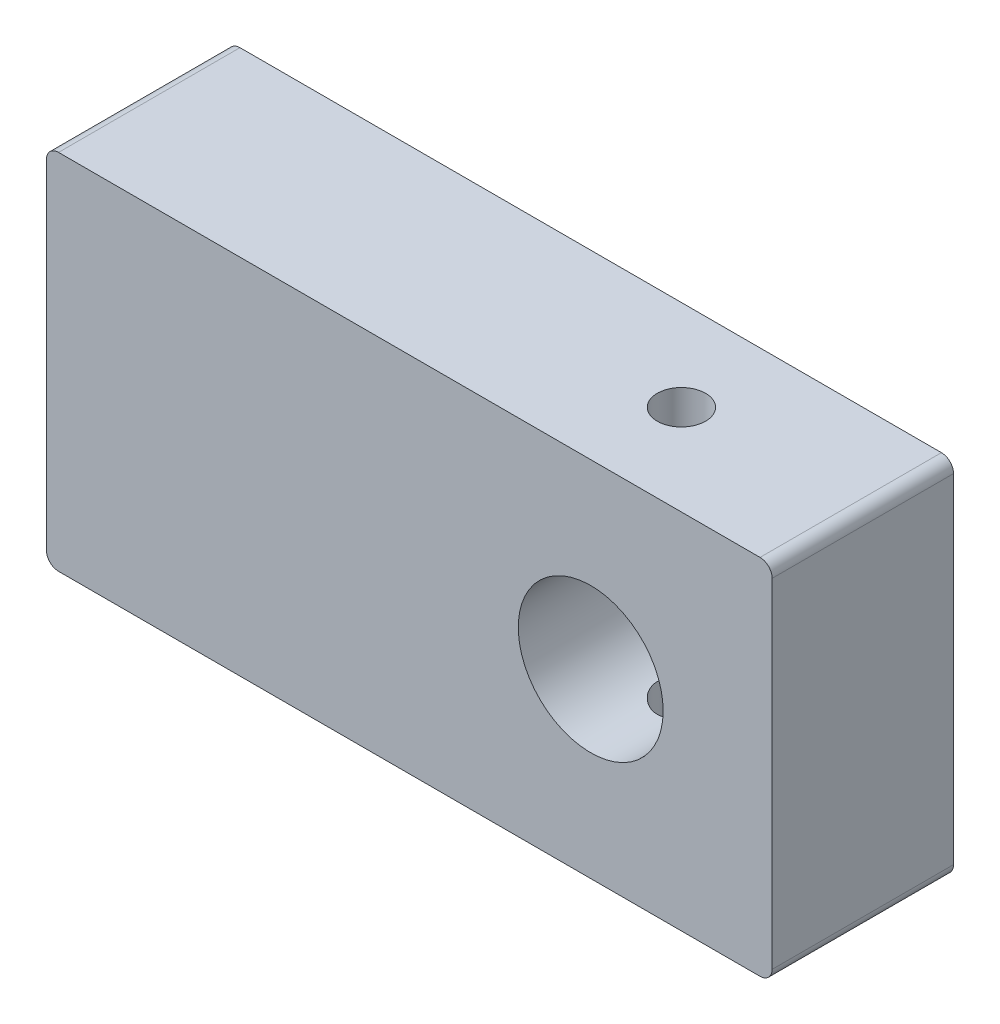
ISO-10303-21;
HEADER;
FILE_DESCRIPTION(('STEP AP214'),'2;1');
FILE_NAME('part.step','',(''),(''),'','','');
FILE_SCHEMA(('AUTOMOTIVE_DESIGN { 1 0 10303 214 1 1 1 1 }'));
ENDSEC;
DATA;
#1=APPLICATION_CONTEXT('core data for automotive mechanical design processes');
#2=APPLICATION_PROTOCOL_DEFINITION('international standard','automotive_design',2000,#1);
#3=PRODUCT_CONTEXT('',#1,'mechanical');
#4=PRODUCT('Part','Part','',(#3));
#5=PRODUCT_RELATED_PRODUCT_CATEGORY('part','',(#4));
#6=PRODUCT_DEFINITION_FORMATION('','',#4);
#7=PRODUCT_DEFINITION_CONTEXT('part definition',#1,'design');
#8=PRODUCT_DEFINITION('design','',#6,#7);
#9=PRODUCT_DEFINITION_SHAPE('','',#8);
#10=(LENGTH_UNIT() NAMED_UNIT(*) SI_UNIT(.MILLI.,.METRE.));
#11=(NAMED_UNIT(*) PLANE_ANGLE_UNIT() SI_UNIT($,.RADIAN.));
#12=(NAMED_UNIT(*) SI_UNIT($,.STERADIAN.) SOLID_ANGLE_UNIT());
#13=UNCERTAINTY_MEASURE_WITH_UNIT(LENGTH_MEASURE(1.E-05),#10,'distance_accuracy_value','');
#14=(GEOMETRIC_REPRESENTATION_CONTEXT(3) GLOBAL_UNCERTAINTY_ASSIGNED_CONTEXT((#13)) GLOBAL_UNIT_ASSIGNED_CONTEXT((#10,
#11,#12)) REPRESENTATION_CONTEXT('',''));
#15=CARTESIAN_POINT('',(0.,0.,0.));
#16=DIRECTION('',(0.,0.,1.));
#17=DIRECTION('',(1.,0.,0.));
#18=AXIS2_PLACEMENT_3D('',#15,#16,#17);
#19=CARTESIAN_POINT('',(29.,14.,7.5));
#20=DIRECTION('',(0.,0.,-1.));
#21=DIRECTION('',(-1.,0.,0.));
#22=AXIS2_PLACEMENT_3D('',#19,#20,#21);
#23=PLANE('',#22);
#24=CARTESIAN_POINT('',(29.,14.,7.5));
#25=DIRECTION('',(0.,0.,1.));
#26=DIRECTION('',(-1.,0.,0.));
#27=AXIS2_PLACEMENT_3D('',#24,#25,#26);
#28=CIRCLE('',#27,1.);
#29=CARTESIAN_POINT('',(30.,14.,7.5));
#30=VERTEX_POINT('',#29);
#31=CARTESIAN_POINT('',(29.,15.,7.5));
#32=VERTEX_POINT('',#31);
#33=EDGE_CURVE('E155',#30,#32,#28,.T.);
#34=ORIENTED_EDGE('',*,*,#33,.T.);
#35=DIRECTION('',(-1.,0.,0.));
#36=VECTOR('',#35,1.);
#37=CARTESIAN_POINT('',(-29.,15.,7.5));
#38=LINE('',#37,#36);
#39=CARTESIAN_POINT('',(-29.,15.,7.5));
#40=VERTEX_POINT('',#39);
#41=EDGE_CURVE('E103',#32,#40,#38,.T.);
#42=ORIENTED_EDGE('',*,*,#41,.T.);
#43=CARTESIAN_POINT('',(-29.,14.,7.5));
#44=DIRECTION('',(0.,0.,1.));
#45=DIRECTION('',(1.,0.,0.));
#46=AXIS2_PLACEMENT_3D('',#43,#44,#45);
#47=CIRCLE('',#46,1.);
#48=CARTESIAN_POINT('',(-30.,14.,7.5));
#49=VERTEX_POINT('',#48);
#50=EDGE_CURVE('E244',#40,#49,#47,.T.);
#51=ORIENTED_EDGE('',*,*,#50,.T.);
#52=DIRECTION('',(0.,-1.,0.));
#53=VECTOR('',#52,1.);
#54=CARTESIAN_POINT('',(-30.,14.,7.5));
#55=LINE('',#54,#53);
#56=CARTESIAN_POINT('',(-30.,-14.,7.5));
#57=VERTEX_POINT('',#56);
#58=EDGE_CURVE('E251',#49,#57,#55,.T.);
#59=ORIENTED_EDGE('',*,*,#58,.T.);
#60=CARTESIAN_POINT('',(-29.,-14.,7.5));
#61=DIRECTION('',(0.,0.,1.));
#62=DIRECTION('',(1.,0.,0.));
#63=AXIS2_PLACEMENT_3D('',#60,#61,#62);
#64=CIRCLE('',#63,1.);
#65=CARTESIAN_POINT('',(-29.,-15.,7.5));
#66=VERTEX_POINT('',#65);
#67=EDGE_CURVE('E122',#57,#66,#64,.T.);
#68=ORIENTED_EDGE('',*,*,#67,.T.);
#69=DIRECTION('',(1.,0.,0.));
#70=VECTOR('',#69,1.);
#71=CARTESIAN_POINT('',(-29.,-15.,7.5));
#72=LINE('',#71,#70);
#73=CARTESIAN_POINT('',(29.,-15.,7.5));
#74=VERTEX_POINT('',#73);
#75=EDGE_CURVE('E116',#66,#74,#72,.T.);
#76=ORIENTED_EDGE('',*,*,#75,.T.);
#77=CARTESIAN_POINT('',(29.,-14.,7.5));
#78=DIRECTION('',(0.,0.,1.));
#79=DIRECTION('',(1.,0.,0.));
#80=AXIS2_PLACEMENT_3D('',#77,#78,#79);
#81=CIRCLE('',#80,1.);
#82=CARTESIAN_POINT('',(30.,-14.,7.5));
#83=VERTEX_POINT('',#82);
#84=EDGE_CURVE('E120',#74,#83,#81,.T.);
#85=ORIENTED_EDGE('',*,*,#84,.T.);
#86=DIRECTION('',(0.,1.,0.));
#87=VECTOR('',#86,1.);
#88=CARTESIAN_POINT('',(30.,14.,7.5));
#89=LINE('',#88,#87);
#90=EDGE_CURVE('E60',#83,#30,#89,.T.);
#91=ORIENTED_EDGE('',*,*,#90,.T.);
#92=EDGE_LOOP('',(#34,#42,#51,#59,#68,#76,#85,#91));
#93=FACE_BOUND('',#92,.T.);
#94=CARTESIAN_POINT('',(15.,0.,7.5));
#95=DIRECTION('',(0.,0.,1.));
#96=DIRECTION('',(1.,0.,0.));
#97=AXIS2_PLACEMENT_3D('',#94,#95,#96);
#98=CIRCLE('',#97,5.99);
#99=CARTESIAN_POINT('',(20.99,0.,7.5));
#100=VERTEX_POINT('',#99);
#101=EDGE_CURVE('E144',#100,#100,#98,.T.);
#102=ORIENTED_EDGE('',*,*,#101,.F.);
#103=EDGE_LOOP('',(#102));
#104=FACE_BOUND('',#103,.T.);
#105=ADVANCED_FACE('F36',(#93,#104),#23,.F.);
#106=CARTESIAN_POINT('',(29.,14.,-7.5));
#107=DIRECTION('',(0.,0.,-1.));
#108=DIRECTION('',(-1.,0.,0.));
#109=AXIS2_PLACEMENT_3D('',#106,#107,#108);
#110=PLANE('',#109);
#111=CARTESIAN_POINT('',(29.,14.,-7.5));
#112=DIRECTION('',(0.,0.,1.));
#113=DIRECTION('',(-1.,0.,0.));
#114=AXIS2_PLACEMENT_3D('',#111,#112,#113);
#115=CIRCLE('',#114,1.);
#116=CARTESIAN_POINT('',(30.,14.,-7.5));
#117=VERTEX_POINT('',#116);
#118=CARTESIAN_POINT('',(29.,15.,-7.5));
#119=VERTEX_POINT('',#118);
#120=EDGE_CURVE('E140',#117,#119,#115,.T.);
#121=ORIENTED_EDGE('',*,*,#120,.F.);
#122=DIRECTION('',(0.,1.,0.));
#123=VECTOR('',#122,1.);
#124=CARTESIAN_POINT('',(30.,14.,-7.5));
#125=LINE('',#124,#123);
#126=CARTESIAN_POINT('',(30.,-14.,-7.5));
#127=VERTEX_POINT('',#126);
#128=EDGE_CURVE('E95',#127,#117,#125,.T.);
#129=ORIENTED_EDGE('',*,*,#128,.F.);
#130=CARTESIAN_POINT('',(29.,-14.,-7.5));
#131=DIRECTION('',(0.,0.,1.));
#132=DIRECTION('',(1.,0.,0.));
#133=AXIS2_PLACEMENT_3D('',#130,#131,#132);
#134=CIRCLE('',#133,1.);
#135=CARTESIAN_POINT('',(29.,-15.,-7.5));
#136=VERTEX_POINT('',#135);
#137=EDGE_CURVE('E89',#136,#127,#134,.T.);
#138=ORIENTED_EDGE('',*,*,#137,.F.);
#139=DIRECTION('',(1.,0.,0.));
#140=VECTOR('',#139,1.);
#141=CARTESIAN_POINT('',(-29.,-15.,-7.5));
#142=LINE('',#141,#140);
#143=CARTESIAN_POINT('',(-29.,-15.,-7.5));
#144=VERTEX_POINT('',#143);
#145=EDGE_CURVE('E130',#144,#136,#142,.T.);
#146=ORIENTED_EDGE('',*,*,#145,.F.);
#147=CARTESIAN_POINT('',(-29.,-14.,-7.5));
#148=DIRECTION('',(0.,0.,1.));
#149=DIRECTION('',(1.,0.,0.));
#150=AXIS2_PLACEMENT_3D('',#147,#148,#149);
#151=CIRCLE('',#150,1.);
#152=CARTESIAN_POINT('',(-30.,-14.,-7.5));
#153=VERTEX_POINT('',#152);
#154=EDGE_CURVE('E150',#153,#144,#151,.T.);
#155=ORIENTED_EDGE('',*,*,#154,.F.);
#156=DIRECTION('',(0.,-1.,0.));
#157=VECTOR('',#156,1.);
#158=CARTESIAN_POINT('',(-30.,14.,-7.5));
#159=LINE('',#158,#157);
#160=CARTESIAN_POINT('',(-30.,14.,-7.5));
#161=VERTEX_POINT('',#160);
#162=EDGE_CURVE('E148',#161,#153,#159,.T.);
#163=ORIENTED_EDGE('',*,*,#162,.F.);
#164=CARTESIAN_POINT('',(-29.,14.,-7.5));
#165=DIRECTION('',(0.,0.,1.));
#166=DIRECTION('',(1.,0.,0.));
#167=AXIS2_PLACEMENT_3D('',#164,#165,#166);
#168=CIRCLE('',#167,1.);
#169=CARTESIAN_POINT('',(-29.,15.,-7.5));
#170=VERTEX_POINT('',#169);
#171=EDGE_CURVE('E146',#170,#161,#168,.T.);
#172=ORIENTED_EDGE('',*,*,#171,.F.);
#173=DIRECTION('',(-1.,0.,0.));
#174=VECTOR('',#173,1.);
#175=CARTESIAN_POINT('',(-29.,15.,-7.5));
#176=LINE('',#175,#174);
#177=EDGE_CURVE('E143',#119,#170,#176,.T.);
#178=ORIENTED_EDGE('',*,*,#177,.F.);
#179=EDGE_LOOP('',(#121,#129,#138,#146,#155,#163,#172,#178));
#180=FACE_BOUND('',#179,.T.);
#181=CARTESIAN_POINT('',(15.,0.,-7.5));
#182=DIRECTION('',(0.,0.,1.));
#183=DIRECTION('',(1.,0.,0.));
#184=AXIS2_PLACEMENT_3D('',#181,#182,#183);
#185=CIRCLE('',#184,5.99);
#186=CARTESIAN_POINT('',(20.99,0.,-7.5));
#187=VERTEX_POINT('',#186);
#188=EDGE_CURVE('E257',#187,#187,#185,.T.);
#189=ORIENTED_EDGE('',*,*,#188,.T.);
#190=EDGE_LOOP('',(#189));
#191=FACE_BOUND('',#190,.T.);
#192=ADVANCED_FACE('F205',(#180,#191),#110,.T.);
#193=CARTESIAN_POINT('',(29.,14.,7.5));
#194=DIRECTION('',(0.,0.,-1.));
#195=DIRECTION('',(-1.,0.,0.));
#196=AXIS2_PLACEMENT_3D('',#193,#194,#195);
#197=CYLINDRICAL_SURFACE('',#196,1.);
#198=ORIENTED_EDGE('',*,*,#120,.T.);
#199=DIRECTION('',(0.,0.,-1.));
#200=VECTOR('',#199,1.);
#201=CARTESIAN_POINT('',(29.,15.,7.5));
#202=LINE('',#201,#200);
#203=EDGE_CURVE('E11',#32,#119,#202,.T.);
#204=ORIENTED_EDGE('',*,*,#203,.F.);
#205=ORIENTED_EDGE('',*,*,#33,.F.);
#206=DIRECTION('',(0.,0.,-1.));
#207=VECTOR('',#206,1.);
#208=CARTESIAN_POINT('',(30.,14.,7.5));
#209=LINE('',#208,#207);
#210=EDGE_CURVE('E136',#30,#117,#209,.T.);
#211=ORIENTED_EDGE('',*,*,#210,.T.);
#212=EDGE_LOOP('',(#198,#204,#205,#211));
#213=FACE_BOUND('',#212,.T.);
#214=ADVANCED_FACE('F38',(#213),#197,.T.);
#215=CARTESIAN_POINT('',(-29.,15.,7.5));
#216=DIRECTION('',(0.,-1.,0.));
#217=DIRECTION('',(0.,0.,-1.));
#218=AXIS2_PLACEMENT_3D('',#215,#216,#217);
#219=PLANE('',#218);
#220=CARTESIAN_POINT('',(15.,15.,0.));
#221=DIRECTION('',(0.,1.,0.));
#222=DIRECTION('',(0.,0.,1.));
#223=AXIS2_PLACEMENT_3D('',#220,#221,#222);
#224=CIRCLE('',#223,2.);
#225=CARTESIAN_POINT('',(15.,15.,2.));
#226=VERTEX_POINT('',#225);
#227=EDGE_CURVE('E171',#226,#226,#224,.T.);
#228=ORIENTED_EDGE('',*,*,#227,.F.);
#229=EDGE_LOOP('',(#228));
#230=FACE_BOUND('',#229,.T.);
#231=ORIENTED_EDGE('',*,*,#177,.T.);
#232=DIRECTION('',(0.,0.,-1.));
#233=VECTOR('',#232,1.);
#234=CARTESIAN_POINT('',(-29.,15.,7.5));
#235=LINE('',#234,#233);
#236=EDGE_CURVE('E51',#40,#170,#235,.T.);
#237=ORIENTED_EDGE('',*,*,#236,.F.);
#238=ORIENTED_EDGE('',*,*,#41,.F.);
#239=ORIENTED_EDGE('',*,*,#203,.T.);
#240=EDGE_LOOP('',(#231,#237,#238,#239));
#241=FACE_BOUND('',#240,.T.);
#242=ADVANCED_FACE('F229',(#230,#241),#219,.F.);
#243=CARTESIAN_POINT('',(-29.,14.,7.5));
#244=DIRECTION('',(0.,0.,-1.));
#245=DIRECTION('',(-1.,0.,0.));
#246=AXIS2_PLACEMENT_3D('',#243,#244,#245);
#247=CYLINDRICAL_SURFACE('',#246,1.);
#248=ORIENTED_EDGE('',*,*,#171,.T.);
#249=DIRECTION('',(0.,0.,-1.));
#250=VECTOR('',#249,1.);
#251=CARTESIAN_POINT('',(-30.,14.,7.5));
#252=LINE('',#251,#250);
#253=EDGE_CURVE('E162',#49,#161,#252,.T.);
#254=ORIENTED_EDGE('',*,*,#253,.F.);
#255=ORIENTED_EDGE('',*,*,#50,.F.);
#256=ORIENTED_EDGE('',*,*,#236,.T.);
#257=EDGE_LOOP('',(#248,#254,#255,#256));
#258=FACE_BOUND('',#257,.T.);
#259=ADVANCED_FACE('F226',(#258),#247,.T.);
#260=CARTESIAN_POINT('',(-30.,14.,7.5));
#261=DIRECTION('',(1.,0.,0.));
#262=DIRECTION('',(0.,1.,0.));
#263=AXIS2_PLACEMENT_3D('',#260,#261,#262);
#264=PLANE('',#263);
#265=CARTESIAN_POINT('',(-30.,7.99999999999999,0.));
#266=DIRECTION('',(-1.,0.,0.));
#267=DIRECTION('',(0.,-1.,0.));
#268=AXIS2_PLACEMENT_3D('',#265,#266,#267);
#269=CIRCLE('',#268,2.);
#270=CARTESIAN_POINT('',(-30.,5.99999999999999,0.));
#271=VERTEX_POINT('',#270);
#272=EDGE_CURVE('E270',#271,#271,#269,.T.);
#273=ORIENTED_EDGE('',*,*,#272,.F.);
#274=EDGE_LOOP('',(#273));
#275=FACE_BOUND('',#274,.T.);
#276=CARTESIAN_POINT('',(-30.,-8.00000000000001,0.));
#277=DIRECTION('',(-1.,0.,0.));
#278=DIRECTION('',(0.,-1.,0.));
#279=AXIS2_PLACEMENT_3D('',#276,#277,#278);
#280=CIRCLE('',#279,2.);
#281=CARTESIAN_POINT('',(-30.,-10.,0.));
#282=VERTEX_POINT('',#281);
#283=EDGE_CURVE('E263',#282,#282,#280,.T.);
#284=ORIENTED_EDGE('',*,*,#283,.F.);
#285=EDGE_LOOP('',(#284));
#286=FACE_BOUND('',#285,.T.);
#287=ORIENTED_EDGE('',*,*,#162,.T.);
#288=DIRECTION('',(0.,0.,-1.));
#289=VECTOR('',#288,1.);
#290=CARTESIAN_POINT('',(-30.,-14.,7.5));
#291=LINE('',#290,#289);
#292=EDGE_CURVE('E159',#57,#153,#291,.T.);
#293=ORIENTED_EDGE('',*,*,#292,.F.);
#294=ORIENTED_EDGE('',*,*,#58,.F.);
#295=ORIENTED_EDGE('',*,*,#253,.T.);
#296=EDGE_LOOP('',(#287,#293,#294,#295));
#297=FACE_BOUND('',#296,.T.);
#298=ADVANCED_FACE('F222',(#275,#286,#297),#264,.F.);
#299=CARTESIAN_POINT('',(-29.,-14.,7.5));
#300=DIRECTION('',(0.,0.,-1.));
#301=DIRECTION('',(-1.,0.,0.));
#302=AXIS2_PLACEMENT_3D('',#299,#300,#301);
#303=CYLINDRICAL_SURFACE('',#302,1.);
#304=ORIENTED_EDGE('',*,*,#154,.T.);
#305=DIRECTION('',(0.,0.,-1.));
#306=VECTOR('',#305,1.);
#307=CARTESIAN_POINT('',(-29.,-15.,7.5));
#308=LINE('',#307,#306);
#309=EDGE_CURVE('E131',#66,#144,#308,.T.);
#310=ORIENTED_EDGE('',*,*,#309,.F.);
#311=ORIENTED_EDGE('',*,*,#67,.F.);
#312=ORIENTED_EDGE('',*,*,#292,.T.);
#313=EDGE_LOOP('',(#304,#310,#311,#312));
#314=FACE_BOUND('',#313,.T.);
#315=ADVANCED_FACE('F218',(#314),#303,.T.);
#316=CARTESIAN_POINT('',(-29.,-15.,7.5));
#317=DIRECTION('',(0.,1.,0.));
#318=DIRECTION('',(0.,0.,1.));
#319=AXIS2_PLACEMENT_3D('',#316,#317,#318);
#320=PLANE('',#319);
#321=CARTESIAN_POINT('',(15.,-15.,0.));
#322=DIRECTION('',(0.,1.,0.));
#323=DIRECTION('',(0.,0.,1.));
#324=AXIS2_PLACEMENT_3D('',#321,#322,#323);
#325=CIRCLE('',#324,2.);
#326=CARTESIAN_POINT('',(15.,-15.,2.));
#327=VERTEX_POINT('',#326);
#328=EDGE_CURVE('E267',#327,#327,#325,.T.);
#329=ORIENTED_EDGE('',*,*,#328,.T.);
#330=EDGE_LOOP('',(#329));
#331=FACE_BOUND('',#330,.T.);
#332=ORIENTED_EDGE('',*,*,#145,.T.);
#333=DIRECTION('',(0.,0.,-1.));
#334=VECTOR('',#333,1.);
#335=CARTESIAN_POINT('',(29.,-15.,7.5));
#336=LINE('',#335,#334);
#337=EDGE_CURVE('E127',#74,#136,#336,.T.);
#338=ORIENTED_EDGE('',*,*,#337,.F.);
#339=ORIENTED_EDGE('',*,*,#75,.F.);
#340=ORIENTED_EDGE('',*,*,#309,.T.);
#341=EDGE_LOOP('',(#332,#338,#339,#340));
#342=FACE_BOUND('',#341,.T.);
#343=ADVANCED_FACE('F128',(#331,#342),#320,.F.);
#344=CARTESIAN_POINT('',(29.,-14.,7.5));
#345=DIRECTION('',(0.,0.,-1.));
#346=DIRECTION('',(-1.,0.,0.));
#347=AXIS2_PLACEMENT_3D('',#344,#345,#346);
#348=CYLINDRICAL_SURFACE('',#347,1.);
#349=ORIENTED_EDGE('',*,*,#137,.T.);
#350=DIRECTION('',(0.,0.,-1.));
#351=VECTOR('',#350,1.);
#352=CARTESIAN_POINT('',(30.,-14.,7.5));
#353=LINE('',#352,#351);
#354=EDGE_CURVE('E132',#83,#127,#353,.T.);
#355=ORIENTED_EDGE('',*,*,#354,.F.);
#356=ORIENTED_EDGE('',*,*,#84,.F.);
#357=ORIENTED_EDGE('',*,*,#337,.T.);
#358=EDGE_LOOP('',(#349,#355,#356,#357));
#359=FACE_BOUND('',#358,.T.);
#360=ADVANCED_FACE('F134',(#359),#348,.T.);
#361=CARTESIAN_POINT('',(30.,14.,7.5));
#362=DIRECTION('',(-1.,0.,0.));
#363=DIRECTION('',(0.,-1.,0.));
#364=AXIS2_PLACEMENT_3D('',#361,#362,#363);
#365=PLANE('',#364);
#366=ORIENTED_EDGE('',*,*,#128,.T.);
#367=ORIENTED_EDGE('',*,*,#210,.F.);
#368=ORIENTED_EDGE('',*,*,#90,.F.);
#369=ORIENTED_EDGE('',*,*,#354,.T.);
#370=EDGE_LOOP('',(#366,#367,#368,#369));
#371=FACE_BOUND('',#370,.T.);
#372=ADVANCED_FACE('F200',(#371),#365,.F.);
#373=CARTESIAN_POINT('',(15.,0.,7.5));
#374=DIRECTION('',(0.,0.,-1.));
#375=DIRECTION('',(-1.,0.,0.));
#376=AXIS2_PLACEMENT_3D('',#373,#374,#375);
#377=CYLINDRICAL_SURFACE('',#376,5.99);
#378=CARTESIAN_POINT('',(15.,-5.99,2.));
#379=CARTESIAN_POINT('',(15.1091163978093,-5.99000033236823,2.00000054381672));
#380=CARTESIAN_POINT('',(15.2182294406697,-5.986990962235,1.99104117540047));
#381=CARTESIAN_POINT('',(15.4332410241099,-5.97528249375806,1.95555054837418));
#382=CARTESIAN_POINT('',(15.5391392404848,-5.96658282354752,1.92901752363394));
#383=CARTESIAN_POINT('',(15.7445903437273,-5.94443889361843,1.85939089846312));
#384=CARTESIAN_POINT('',(15.8441535350756,-5.93100258411266,1.81632503686161));
#385=CARTESIAN_POINT('',(16.0346437218337,-5.90075640910268,1.71498079385121));
#386=CARTESIAN_POINT('',(16.125568999862,-5.88394587479783,1.65669939590128));
#387=CARTESIAN_POINT('',(16.2993606385912,-5.84806691859647,1.52445253061945));
#388=CARTESIAN_POINT('',(16.3818855397189,-5.82894428193318,1.45005312982997));
#389=CARTESIAN_POINT('',(16.5335480236868,-5.79089423428207,1.28860477853103));
#390=CARTESIAN_POINT('',(16.6026826452678,-5.77196686735233,1.2015530373915));
#391=CARTESIAN_POINT('',(16.7275540729013,-5.73585340839862,1.01419364375007));
#392=CARTESIAN_POINT('',(16.7828465145985,-5.71873335391713,0.913575873638488));
#393=CARTESIAN_POINT('',(16.8755789975968,-5.68899748004735,0.703805583515214));
#394=CARTESIAN_POINT('',(16.9130245076249,-5.67638028117436,0.594655689899075));
#395=CARTESIAN_POINT('',(16.9677183651493,-5.65764967981513,0.374802935816422));
#396=CARTESIAN_POINT('',(16.9856066862576,-5.65133083500935,0.264277307715913));
#397=CARTESIAN_POINT('',(17.0026790042081,-5.64530482550313,0.0416266908977955));
#398=CARTESIAN_POINT('',(17.0018688038223,-5.64559560961502,-0.0704977908477283));
#399=CARTESIAN_POINT('',(16.9820638834885,-5.65257600265481,-0.287700164126641));
#400=CARTESIAN_POINT('',(16.9639050073549,-5.65897148031504,-0.392865363767549));
#401=CARTESIAN_POINT('',(16.911281976309,-5.67695926524099,-0.598560802194556));
#402=CARTESIAN_POINT('',(16.8768158630839,-5.68855219665278,-0.699090482716078));
#403=CARTESIAN_POINT('',(16.7920107060976,-5.71583782409784,-0.894557731195906));
#404=CARTESIAN_POINT('',(16.741424399591,-5.73159368351693,-0.98937882334822));
#405=CARTESIAN_POINT('',(16.6259864822944,-5.76540348743551,-1.16945047897322));
#406=CARTESIAN_POINT('',(16.5611307400021,-5.78345809686463,-1.25469825981702));
#407=CARTESIAN_POINT('',(16.4149830608308,-5.82098761378783,-1.41789927441068));
#408=CARTESIAN_POINT('',(16.3330080097474,-5.84048737441223,-1.49523631183624));
#409=CARTESIAN_POINT('',(16.1570124345026,-5.87788274201041,-1.63522662314916));
#410=CARTESIAN_POINT('',(16.0629907487094,-5.89577819400081,-1.69787847932444));
#411=CARTESIAN_POINT('',(15.8642605578968,-5.92818489439092,-1.80721831716578));
#412=CARTESIAN_POINT('',(15.7594547395554,-5.94266057607981,-1.85374069336573));
#413=CARTESIAN_POINT('',(15.5429056332427,-5.9663384363411,-1.92830339244346));
#414=CARTESIAN_POINT('',(15.4311647784378,-5.97554245302031,-1.9563501578491));
#415=CARTESIAN_POINT('',(15.2091336701035,-5.9873352094298,-1.99207264643697));
#416=CARTESIAN_POINT('',(15.0989915472382,-5.99019414984878,-2.0005809834215));
#417=CARTESIAN_POINT('',(14.8788311117908,-5.98978532291205,-1.99935753699191));
#418=CARTESIAN_POINT('',(14.768812781392,-5.98651859362399,-1.98962884405966));
#419=CARTESIAN_POINT('',(14.5553587473067,-5.97440381965107,-1.95286601322849));
#420=CARTESIAN_POINT('',(14.4518246571723,-5.96572085053925,-1.92634337078708));
#421=CARTESIAN_POINT('',(14.2507177714144,-5.94381330718601,-1.85738545823129));
#422=CARTESIAN_POINT('',(14.153145738319,-5.93058815343983,-1.81494815761629));
#423=CARTESIAN_POINT('',(13.9638663772287,-5.90050491702575,-1.71412601336891));
#424=CARTESIAN_POINT('',(13.8723813541619,-5.88356028293682,-1.65535038788918));
#425=CARTESIAN_POINT('',(13.7003021834421,-5.84795857865274,-1.5239789117709));
#426=CARTESIAN_POINT('',(13.6197113847318,-5.8293009848309,-1.451378827865));
#427=CARTESIAN_POINT('',(13.4678837902029,-5.79129757883485,-1.29050412731179));
#428=CARTESIAN_POINT('',(13.3972410609988,-5.77195917653075,-1.20166574251754));
#429=CARTESIAN_POINT('',(13.2717921452928,-5.73564962026084,-1.01298100565143));
#430=CARTESIAN_POINT('',(13.2169861031795,-5.71867848787898,-0.913134553226632));
#431=CARTESIAN_POINT('',(13.1250172714671,-5.68918987747605,-0.705216694758754));
#432=CARTESIAN_POINT('',(13.0878198564248,-5.67666367124699,-0.597161919394719));
#433=CARTESIAN_POINT('',(13.0323178424181,-5.65766773861097,-0.375807008967096));
#434=CARTESIAN_POINT('',(13.0140046946135,-5.6511952718213,-0.262509271666495));
#435=CARTESIAN_POINT('',(12.9974590899184,-5.64535196667764,-0.0401673102839452));
#436=CARTESIAN_POINT('',(12.998240272803,-5.64563228671538,0.0687951594102822));
#437=CARTESIAN_POINT('',(13.0174323677256,-5.65240008590833,0.284949794990335));
#438=CARTESIAN_POINT('',(13.0358422237892,-5.65888719327106,0.392142066521486));
#439=CARTESIAN_POINT('',(13.0890699353205,-5.6770774786505,0.599673557495536));
#440=CARTESIAN_POINT('',(13.1235673244604,-5.6886785490201,0.700104622991352));
#441=CARTESIAN_POINT('',(13.2077309058483,-5.71575161332893,0.893829920137948));
#442=CARTESIAN_POINT('',(13.2574004721492,-5.73122446815344,0.987122558538518));
#443=CARTESIAN_POINT('',(13.3730342779696,-5.76514173041397,1.16834750730824));
#444=CARTESIAN_POINT('',(13.4396164055193,-5.78368653629977,1.25586665985424));
#445=CARTESIAN_POINT('',(13.5861418465822,-5.82123853974796,1.41880827890006));
#446=CARTESIAN_POINT('',(13.6660889437481,-5.84024586694547,1.49422730794519));
#447=CARTESIAN_POINT('',(13.8408335382939,-5.87747469608901,1.63380442536111));
#448=CARTESIAN_POINT('',(13.9360899217051,-5.89563629218809,1.69740599235488));
#449=CARTESIAN_POINT('',(14.1365401393967,-5.9283074294023,1.80762540877004));
#450=CARTESIAN_POINT('',(14.2417314636631,-5.94281788958243,1.85424753358618));
#451=CARTESIAN_POINT('',(14.4543555525016,-5.96601219371907,1.92726487238182));
#452=CARTESIAN_POINT('',(14.5614908950278,-5.97492238670905,1.95445297153282));
#453=CARTESIAN_POINT('',(14.7790859274754,-5.98691530996021,1.99081775140051));
#454=CARTESIAN_POINT('',(14.8895446826318,-5.98999966355342,1.99999944951034));
#455=CARTESIAN_POINT('',(15.,-5.99,2.));
#456=B_SPLINE_CURVE_WITH_KNOTS('',3,(#378,#379,#380,#381,#382,#383,#384,#385,#386,#387,#388,
#389,#390,#391,#392,#393,#394,#395,#396,#397,#398,#399,#400,#401,#402,#403,#404,#405,#406,#407,
#408,#409,#410,#411,#412,#413,#414,#415,#416,#417,#418,#419,#420,#421,#422,#423,#424,#425,#426,
#427,#428,#429,#430,#431,#432,#433,#434,#435,#436,#437,#438,#439,#440,#441,#442,#443,#444,#445,
#446,#447,#448,#449,#450,#451,#452,#453,#454,#455),.UNSPECIFIED.,.T.,.F.,(4,2,2,2,2,2,2,2,2,2,2,
2,2,2,2,2,2,2,2,2,2,2,2,2,2,2,2,2,2,2,2,2,2,2,2,2,2,2,4),(0.,0.326942713215798,
0.653918288746497,0.980347644800603,1.30684176599209,1.64355840287043,1.98034941978628,
2.32686257289712,2.67326947770676,3.00796608849903,3.34255883322002,3.66180353030587,
3.98108657476818,4.3055239735915,4.63005543233324,4.97159018189292,5.31315788975848,
5.65813535306547,6.00299245742491,6.33285702899493,6.66266570613855,6.98288306558376,
7.30314129445086,7.63183901113153,7.96063754257385,8.30442823983516,8.64822207145737,
8.99133703263057,9.33429659860766,9.6595791248066,9.98484216749168,10.303885891748,
10.623000618014,10.9560783958053,11.2892506288449,11.6354677019699,11.981597537851,
12.3126442796273,12.6435987637792),.UNSPECIFIED.);
#457=CARTESIAN_POINT('',(15.,-5.99,2.));
#458=VERTEX_POINT('',#457);
#459=EDGE_CURVE('E40',#458,#458,#456,.T.);
#460=ORIENTED_EDGE('',*,*,#459,.F.);
#461=EDGE_LOOP('',(#460));
#462=FACE_BOUND('',#461,.T.);
#463=CARTESIAN_POINT('',(15.,5.99,2.));
#464=CARTESIAN_POINT('',(14.8908836021907,5.99000033236823,2.00000054381672));
#465=CARTESIAN_POINT('',(14.7817705593303,5.986990962235,1.99104117540047));
#466=CARTESIAN_POINT('',(14.5667589758901,5.97528249375806,1.95555054837418));
#467=CARTESIAN_POINT('',(14.4608607595152,5.96658282354752,1.92901752363394));
#468=CARTESIAN_POINT('',(14.2554096562727,5.94443889361843,1.85939089846312));
#469=CARTESIAN_POINT('',(14.1558464649244,5.93100258411266,1.81632503686161));
#470=CARTESIAN_POINT('',(13.9653562781663,5.90075640910268,1.71498079385121));
#471=CARTESIAN_POINT('',(13.874431000138,5.88394587479783,1.65669939590128));
#472=CARTESIAN_POINT('',(13.7006393614088,5.84806691859647,1.52445253061945));
#473=CARTESIAN_POINT('',(13.6181144602811,5.82894428193318,1.45005312982997));
#474=CARTESIAN_POINT('',(13.4664519763132,5.79089423428207,1.28860477853103));
#475=CARTESIAN_POINT('',(13.3973173547322,5.77196686735233,1.2015530373915));
#476=CARTESIAN_POINT('',(13.2724459270987,5.73585340839862,1.01419364375008));
#477=CARTESIAN_POINT('',(13.2171534854015,5.71873335391713,0.913575873638491));
#478=CARTESIAN_POINT('',(13.1244210024032,5.68899748004735,0.703805583515217));
#479=CARTESIAN_POINT('',(13.0869754923751,5.67638028117436,0.594655689899077));
#480=CARTESIAN_POINT('',(13.0322816348507,5.65764967981513,0.374802935816425));
#481=CARTESIAN_POINT('',(13.0143933137424,5.65133083500935,0.264277307715916));
#482=CARTESIAN_POINT('',(12.9973209957919,5.64530482550313,0.0416266908977976));
#483=CARTESIAN_POINT('',(12.9981311961777,5.64559560961502,-0.0704977908477262));
#484=CARTESIAN_POINT('',(13.0179361165115,5.65257600265481,-0.287700164126639));
#485=CARTESIAN_POINT('',(13.0360949926451,5.65897148031504,-0.392865363767547));
#486=CARTESIAN_POINT('',(13.088718023691,5.67695926524099,-0.598560802194555));
#487=CARTESIAN_POINT('',(13.1231841369161,5.68855219665278,-0.699090482716076));
#488=CARTESIAN_POINT('',(13.2079892939024,5.71583782409784,-0.894557731195905));
#489=CARTESIAN_POINT('',(13.258575600409,5.73159368351693,-0.98937882334822));
#490=CARTESIAN_POINT('',(13.3740135177056,5.76540348743551,-1.16945047897322));
#491=CARTESIAN_POINT('',(13.4388692599979,5.78345809686463,-1.25469825981702));
#492=CARTESIAN_POINT('',(13.5850169391692,5.82098761378783,-1.41789927441068));
#493=CARTESIAN_POINT('',(13.6669919902526,5.84048737441223,-1.49523631183623));
#494=CARTESIAN_POINT('',(13.8429875654973,5.87788274201041,-1.63522662314916));
#495=CARTESIAN_POINT('',(13.9370092512906,5.89577819400081,-1.69787847932444));
#496=CARTESIAN_POINT('',(14.1357394421032,5.92818489439092,-1.80721831716578));
#497=CARTESIAN_POINT('',(14.2405452604446,5.94266057607981,-1.85374069336573));
#498=CARTESIAN_POINT('',(14.4570943667573,5.9663384363411,-1.92830339244346));
#499=CARTESIAN_POINT('',(14.5688352215622,5.97554245302031,-1.9563501578491));
#500=CARTESIAN_POINT('',(14.7908663298965,5.9873352094298,-1.99207264643697));
#501=CARTESIAN_POINT('',(14.9010084527618,5.99019414984878,-2.0005809834215));
#502=CARTESIAN_POINT('',(15.1211688882092,5.98978532291205,-1.99935753699191));
#503=CARTESIAN_POINT('',(15.231187218608,5.98651859362399,-1.98962884405966));
#504=CARTESIAN_POINT('',(15.4446412526933,5.97440381965107,-1.95286601322849));
#505=CARTESIAN_POINT('',(15.5481753428277,5.96572085053925,-1.92634337078708));
#506=CARTESIAN_POINT('',(15.7492822285856,5.94381330718601,-1.85738545823129));
#507=CARTESIAN_POINT('',(15.846854261681,5.93058815343983,-1.81494815761629));
#508=CARTESIAN_POINT('',(16.0361336227713,5.90050491702575,-1.71412601336891));
#509=CARTESIAN_POINT('',(16.1276186458381,5.88356028293682,-1.65535038788918));
#510=CARTESIAN_POINT('',(16.2996978165579,5.84795857865274,-1.5239789117709));
#511=CARTESIAN_POINT('',(16.3802886152682,5.8293009848309,-1.451378827865));
#512=CARTESIAN_POINT('',(16.5321162097971,5.79129757883485,-1.2905041273118));
#513=CARTESIAN_POINT('',(16.6027589390012,5.77195917653075,-1.20166574251755));
#514=CARTESIAN_POINT('',(16.7282078547072,5.73564962026084,-1.01298100565143));
#515=CARTESIAN_POINT('',(16.7830138968205,5.71867848787898,-0.913134553226635));
#516=CARTESIAN_POINT('',(16.8749827285329,5.68918987747605,-0.705216694758757));
#517=CARTESIAN_POINT('',(16.9121801435752,5.67666367124699,-0.597161919394722));
#518=CARTESIAN_POINT('',(16.9676821575819,5.65766773861097,-0.375807008967099));
#519=CARTESIAN_POINT('',(16.9859953053865,5.6511952718213,-0.262509271666497));
#520=CARTESIAN_POINT('',(17.0025409100816,5.64535196667764,-0.0401673102839464));
#521=CARTESIAN_POINT('',(17.001759727197,5.64563228671538,0.0687951594102818));
#522=CARTESIAN_POINT('',(16.9825676322744,5.65240008590833,0.284949794990334));
#523=CARTESIAN_POINT('',(16.9641577762108,5.65888719327106,0.392142066521485));
#524=CARTESIAN_POINT('',(16.9109300646795,5.6770774786505,0.599673557495534));
#525=CARTESIAN_POINT('',(16.8764326755396,5.6886785490201,0.70010462299135));
#526=CARTESIAN_POINT('',(16.7922690941517,5.71575161332893,0.893829920137946));
#527=CARTESIAN_POINT('',(16.7425995278508,5.73122446815344,0.987122558538516));
#528=CARTESIAN_POINT('',(16.6269657220304,5.76514173041396,1.16834750730824));
#529=CARTESIAN_POINT('',(16.5603835944807,5.78368653629977,1.25586665985424));
#530=CARTESIAN_POINT('',(16.4138581534178,5.82123853974796,1.41880827890005));
#531=CARTESIAN_POINT('',(16.3339110562519,5.84024586694547,1.49422730794519));
#532=CARTESIAN_POINT('',(16.1591664617061,5.87747469608901,1.63380442536111));
#533=CARTESIAN_POINT('',(16.0639100782949,5.89563629218809,1.69740599235488));
#534=CARTESIAN_POINT('',(15.8634598606033,5.9283074294023,1.80762540877004));
#535=CARTESIAN_POINT('',(15.7582685363369,5.94281788958243,1.85424753358618));
#536=CARTESIAN_POINT('',(15.5456444474984,5.96601219371907,1.92726487238182));
#537=CARTESIAN_POINT('',(15.4385091049722,5.97492238670905,1.95445297153282));
#538=CARTESIAN_POINT('',(15.2209140725246,5.98691530996021,1.99081775140051));
#539=CARTESIAN_POINT('',(15.1104553173682,5.98999966355342,1.99999944951034));
#540=CARTESIAN_POINT('',(15.,5.99,2.));
#541=B_SPLINE_CURVE_WITH_KNOTS('',3,(#463,#464,#465,#466,#467,#468,#469,#470,#471,#472,#473,
#474,#475,#476,#477,#478,#479,#480,#481,#482,#483,#484,#485,#486,#487,#488,#489,#490,#491,#492,
#493,#494,#495,#496,#497,#498,#499,#500,#501,#502,#503,#504,#505,#506,#507,#508,#509,#510,#511,
#512,#513,#514,#515,#516,#517,#518,#519,#520,#521,#522,#523,#524,#525,#526,#527,#528,#529,#530,
#531,#532,#533,#534,#535,#536,#537,#538,#539,#540),.UNSPECIFIED.,.T.,.F.,(4,2,2,2,2,2,2,2,2,2,2,
2,2,2,2,2,2,2,2,2,2,2,2,2,2,2,2,2,2,2,2,2,2,2,2,2,2,2,4),(0.,0.326942713215795,
0.653918288746495,0.980347644800605,1.30684176599209,1.64355840287043,1.98034941978627,
2.32686257289711,2.67326947770676,3.00796608849903,3.34255883322002,3.66180353030587,
3.98108657476818,4.3055239735915,4.63005543233324,4.97159018189292,5.31315788975848,
5.65813535306546,6.0029924574249,6.33285702899492,6.66266570613854,6.98288306558375,
7.30314129445085,7.63183901113153,7.96063754257384,8.30442823983516,8.64822207145737,
8.99133703263057,9.33429659860765,9.6595791248066,9.98484216749167,10.303885891748,
10.623000618014,10.9560783958053,11.2892506288449,11.6354677019699,11.981597537851,
12.3126442796273,12.6435987637792),.UNSPECIFIED.);
#542=CARTESIAN_POINT('',(15.,5.99,2.));
#543=VERTEX_POINT('',#542);
#544=EDGE_CURVE('E166',#543,#543,#541,.T.);
#545=ORIENTED_EDGE('',*,*,#544,.F.);
#546=EDGE_LOOP('',(#545));
#547=FACE_BOUND('',#546,.T.);
#548=ORIENTED_EDGE('',*,*,#101,.T.);
#549=EDGE_LOOP('',(#548));
#550=FACE_BOUND('',#549,.T.);
#551=ORIENTED_EDGE('',*,*,#188,.F.);
#552=EDGE_LOOP('',(#551));
#553=FACE_BOUND('',#552,.T.);
#554=ADVANCED_FACE('F172',(#462,#547,#550,#553),#377,.F.);
#555=CARTESIAN_POINT('',(-15.,-8.,0.));
#556=DIRECTION('',(-1.,0.,0.));
#557=DIRECTION('',(0.,-1.,0.));
#558=AXIS2_PLACEMENT_3D('',#555,#556,#557);
#559=CYLINDRICAL_SURFACE('',#558,2.);
#560=CARTESIAN_POINT('',(-15.,-8.,0.));
#561=DIRECTION('',(-1.,0.,0.));
#562=DIRECTION('',(0.,-1.,0.));
#563=AXIS2_PLACEMENT_3D('',#560,#561,#562);
#564=CIRCLE('',#563,2.);
#565=CARTESIAN_POINT('',(-15.,-10.,0.));
#566=VERTEX_POINT('',#565);
#567=EDGE_CURVE('E266',#566,#566,#564,.T.);
#568=ORIENTED_EDGE('',*,*,#567,.F.);
#569=EDGE_LOOP('',(#568));
#570=FACE_BOUND('',#569,.T.);
#571=ORIENTED_EDGE('',*,*,#283,.T.);
#572=EDGE_LOOP('',(#571));
#573=FACE_BOUND('',#572,.T.);
#574=ADVANCED_FACE('F193',(#570,#573),#559,.F.);
#575=CARTESIAN_POINT('',(-15.,-8.,0.));
#576=DIRECTION('',(-1.,0.,0.));
#577=DIRECTION('',(0.,-1.,0.));
#578=AXIS2_PLACEMENT_3D('',#575,#576,#577);
#579=PLANE('',#578);
#580=ORIENTED_EDGE('',*,*,#567,.T.);
#581=EDGE_LOOP('',(#580));
#582=FACE_BOUND('',#581,.T.);
#583=ADVANCED_FACE('F190',(#582),#579,.T.);
#584=CARTESIAN_POINT('',(-15.,8.,0.));
#585=DIRECTION('',(-1.,0.,0.));
#586=DIRECTION('',(0.,-1.,0.));
#587=AXIS2_PLACEMENT_3D('',#584,#585,#586);
#588=CYLINDRICAL_SURFACE('',#587,2.);
#589=CARTESIAN_POINT('',(-15.,8.,0.));
#590=DIRECTION('',(-1.,0.,0.));
#591=DIRECTION('',(0.,-1.,0.));
#592=AXIS2_PLACEMENT_3D('',#589,#590,#591);
#593=CIRCLE('',#592,2.);
#594=CARTESIAN_POINT('',(-15.,6.,0.));
#595=VERTEX_POINT('',#594);
#596=EDGE_CURVE('E260',#595,#595,#593,.T.);
#597=ORIENTED_EDGE('',*,*,#596,.F.);
#598=EDGE_LOOP('',(#597));
#599=FACE_BOUND('',#598,.T.);
#600=ORIENTED_EDGE('',*,*,#272,.T.);
#601=EDGE_LOOP('',(#600));
#602=FACE_BOUND('',#601,.T.);
#603=ADVANCED_FACE('F186',(#599,#602),#588,.F.);
#604=CARTESIAN_POINT('',(-15.,8.,0.));
#605=DIRECTION('',(-1.,0.,0.));
#606=DIRECTION('',(0.,-1.,0.));
#607=AXIS2_PLACEMENT_3D('',#604,#605,#606);
#608=PLANE('',#607);
#609=ORIENTED_EDGE('',*,*,#596,.T.);
#610=EDGE_LOOP('',(#609));
#611=FACE_BOUND('',#610,.T.);
#612=ADVANCED_FACE('F181',(#611),#608,.T.);
#613=CARTESIAN_POINT('',(15.,-20.,0.));
#614=DIRECTION('',(0.,1.,0.));
#615=DIRECTION('',(0.,0.,1.));
#616=AXIS2_PLACEMENT_3D('',#613,#614,#615);
#617=CYLINDRICAL_SURFACE('',#616,2.);
#618=ORIENTED_EDGE('',*,*,#544,.T.);
#619=EDGE_LOOP('',(#618));
#620=FACE_BOUND('',#619,.T.);
#621=ORIENTED_EDGE('',*,*,#227,.T.);
#622=EDGE_LOOP('',(#621));
#623=FACE_BOUND('',#622,.T.);
#624=ADVANCED_FACE('F176',(#620,#623),#617,.F.);
#625=ORIENTED_EDGE('',*,*,#459,.T.);
#626=EDGE_LOOP('',(#625));
#627=FACE_BOUND('',#626,.T.);
#628=ORIENTED_EDGE('',*,*,#328,.F.);
#629=EDGE_LOOP('',(#628));
#630=FACE_BOUND('',#629,.T.);
#631=ADVANCED_FACE('F180',(#627,#630),#617,.F.);
#632=CLOSED_SHELL('',(#105,#192,#214,#242,#259,#298,#315,#343,#360,#372,#554,#574,#583,#603,
#612,#624,#631));
#633=MANIFOLD_SOLID_BREP('B2',#632);
#634=ADVANCED_BREP_SHAPE_REPRESENTATION('',(#18,#633),#14);
#635=SHAPE_DEFINITION_REPRESENTATION(#9,#634);
ENDSEC;
END-ISO-10303-21;
